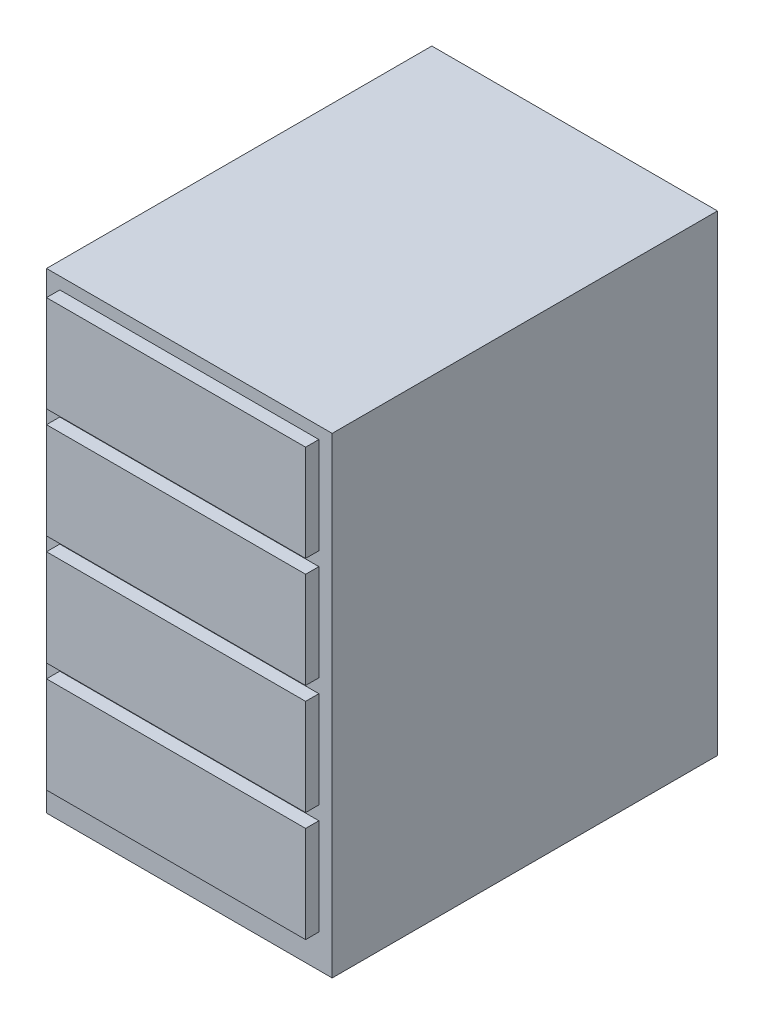
ISO-10303-21;
HEADER;
FILE_DESCRIPTION(('STEP AP214'),'2;1');
FILE_NAME('part.step','',(''),(''),'','','');
FILE_SCHEMA(('AUTOMOTIVE_DESIGN { 1 0 10303 214 1 1 1 1 }'));
ENDSEC;
DATA;
#1=APPLICATION_CONTEXT('core data for automotive mechanical design processes');
#2=APPLICATION_PROTOCOL_DEFINITION('international standard','automotive_design',2000,#1);
#3=PRODUCT_CONTEXT('',#1,'mechanical');
#4=PRODUCT('Part','Part','',(#3));
#5=PRODUCT_RELATED_PRODUCT_CATEGORY('part','',(#4));
#6=PRODUCT_DEFINITION_FORMATION('','',#4);
#7=PRODUCT_DEFINITION_CONTEXT('part definition',#1,'design');
#8=PRODUCT_DEFINITION('design','',#6,#7);
#9=PRODUCT_DEFINITION_SHAPE('','',#8);
#10=(LENGTH_UNIT() NAMED_UNIT(*) SI_UNIT(.MILLI.,.METRE.));
#11=(NAMED_UNIT(*) PLANE_ANGLE_UNIT() SI_UNIT($,.RADIAN.));
#12=(NAMED_UNIT(*) SI_UNIT($,.STERADIAN.) SOLID_ANGLE_UNIT());
#13=UNCERTAINTY_MEASURE_WITH_UNIT(LENGTH_MEASURE(1.E-05),#10,'distance_accuracy_value','');
#14=(GEOMETRIC_REPRESENTATION_CONTEXT(3) GLOBAL_UNCERTAINTY_ASSIGNED_CONTEXT((#13)) GLOBAL_UNIT_ASSIGNED_CONTEXT((#10,
#11,#12)) REPRESENTATION_CONTEXT('',''));
#15=CARTESIAN_POINT('',(0.,0.,0.));
#16=DIRECTION('',(0.,0.,1.));
#17=DIRECTION('',(1.,0.,0.));
#18=AXIS2_PLACEMENT_3D('',#15,#16,#17);
#19=CARTESIAN_POINT('',(0.,0.,580.));
#20=DIRECTION('',(0.,0.,-1.));
#21=DIRECTION('',(-1.,0.,0.));
#22=AXIS2_PLACEMENT_3D('',#19,#20,#21);
#23=PLANE('',#22);
#24=DIRECTION('',(1.,0.,0.));
#25=VECTOR('',#24,1.);
#26=CARTESIAN_POINT('',(20.,547.,580.));
#27=LINE('',#26,#25);
#28=CARTESIAN_POINT('',(20.,547.,580.));
#29=VERTEX_POINT('',#28);
#30=CARTESIAN_POINT('',(410.,547.,580.));
#31=VERTEX_POINT('',#30);
#32=EDGE_CURVE('E190',#29,#31,#27,.T.);
#33=ORIENTED_EDGE('',*,*,#32,.F.);
#34=DIRECTION('',(0.,-1.,0.));
#35=VECTOR('',#34,1.);
#36=CARTESIAN_POINT('',(20.,547.,580.));
#37=LINE('',#36,#35);
#38=CARTESIAN_POINT('',(20.,692.,580.));
#39=VERTEX_POINT('',#38);
#40=EDGE_CURVE('E203',#39,#29,#37,.T.);
#41=ORIENTED_EDGE('',*,*,#40,.F.);
#42=DIRECTION('',(-1.,0.,0.));
#43=VECTOR('',#42,1.);
#44=CARTESIAN_POINT('',(20.,692.,580.));
#45=LINE('',#44,#43);
#46=CARTESIAN_POINT('',(410.,692.,580.));
#47=VERTEX_POINT('',#46);
#48=EDGE_CURVE('E212',#47,#39,#45,.T.);
#49=ORIENTED_EDGE('',*,*,#48,.F.);
#50=DIRECTION('',(0.,1.,0.));
#51=VECTOR('',#50,1.);
#52=CARTESIAN_POINT('',(410.,547.,580.));
#53=LINE('',#52,#51);
#54=EDGE_CURVE('E193',#31,#47,#53,.T.);
#55=ORIENTED_EDGE('',*,*,#54,.F.);
#56=EDGE_LOOP('',(#33,#41,#49,#55));
#57=FACE_BOUND('',#56,.T.);
#58=DIRECTION('',(0.,-1.,0.));
#59=VECTOR('',#58,1.);
#60=CARTESIAN_POINT('',(20.,526.333333333333,580.));
#61=LINE('',#60,#59);
#62=CARTESIAN_POINT('',(20.,526.333333333333,580.));
#63=VERTEX_POINT('',#62);
#64=CARTESIAN_POINT('',(20.,381.333333333333,580.));
#65=VERTEX_POINT('',#64);
#66=EDGE_CURVE('E261',#63,#65,#61,.T.);
#67=ORIENTED_EDGE('',*,*,#66,.F.);
#68=DIRECTION('',(-1.,0.,0.));
#69=VECTOR('',#68,1.);
#70=CARTESIAN_POINT('',(20.,526.333333333333,580.));
#71=LINE('',#70,#69);
#72=CARTESIAN_POINT('',(410.,526.333333333333,580.));
#73=VERTEX_POINT('',#72);
#74=EDGE_CURVE('E266',#73,#63,#71,.T.);
#75=ORIENTED_EDGE('',*,*,#74,.F.);
#76=DIRECTION('',(0.,1.,0.));
#77=VECTOR('',#76,1.);
#78=CARTESIAN_POINT('',(410.,526.333333333333,580.));
#79=LINE('',#78,#77);
#80=CARTESIAN_POINT('',(410.,381.333333333333,580.));
#81=VERTEX_POINT('',#80);
#82=EDGE_CURVE('E278',#81,#73,#79,.T.);
#83=ORIENTED_EDGE('',*,*,#82,.F.);
#84=DIRECTION('',(1.,0.,0.));
#85=VECTOR('',#84,1.);
#86=CARTESIAN_POINT('',(20.,381.333333333333,580.));
#87=LINE('',#86,#85);
#88=EDGE_CURVE('E275',#65,#81,#87,.T.);
#89=ORIENTED_EDGE('',*,*,#88,.F.);
#90=EDGE_LOOP('',(#67,#75,#83,#89));
#91=FACE_BOUND('',#90,.T.);
#92=DIRECTION('',(0.,-1.,0.));
#93=VECTOR('',#92,1.);
#94=CARTESIAN_POINT('',(0.,0.,580.));
#95=LINE('',#94,#93);
#96=CARTESIAN_POINT('',(0.,710.,580.));
#97=VERTEX_POINT('',#96);
#98=CARTESIAN_POINT('',(0.,0.,580.));
#99=VERTEX_POINT('',#98);
#100=EDGE_CURVE('E295',#97,#99,#95,.T.);
#101=ORIENTED_EDGE('',*,*,#100,.T.);
#102=DIRECTION('',(1.,0.,0.));
#103=VECTOR('',#102,1.);
#104=CARTESIAN_POINT('',(0.,0.,580.));
#105=LINE('',#104,#103);
#106=CARTESIAN_POINT('',(430.,0.,580.));
#107=VERTEX_POINT('',#106);
#108=EDGE_CURVE('E298',#99,#107,#105,.T.);
#109=ORIENTED_EDGE('',*,*,#108,.T.);
#110=DIRECTION('',(0.,1.,0.));
#111=VECTOR('',#110,1.);
#112=CARTESIAN_POINT('',(430.,0.,580.));
#113=LINE('',#112,#111);
#114=CARTESIAN_POINT('',(430.,710.,580.));
#115=VERTEX_POINT('',#114);
#116=EDGE_CURVE('E301',#107,#115,#113,.T.);
#117=ORIENTED_EDGE('',*,*,#116,.T.);
#118=DIRECTION('',(-1.,0.,0.));
#119=VECTOR('',#118,1.);
#120=CARTESIAN_POINT('',(0.,710.,580.));
#121=LINE('',#120,#119);
#122=EDGE_CURVE('E303',#115,#97,#121,.T.);
#123=ORIENTED_EDGE('',*,*,#122,.T.);
#124=EDGE_LOOP('',(#101,#109,#117,#123));
#125=FACE_BOUND('',#124,.T.);
#126=DIRECTION('',(0.,-1.,0.));
#127=VECTOR('',#126,1.);
#128=CARTESIAN_POINT('',(20.,195.,580.));
#129=LINE('',#128,#127);
#130=CARTESIAN_POINT('',(20.,195.,580.));
#131=VERTEX_POINT('',#130);
#132=CARTESIAN_POINT('',(20.,50.,580.));
#133=VERTEX_POINT('',#132);
#134=EDGE_CURVE('E228',#131,#133,#129,.T.);
#135=ORIENTED_EDGE('',*,*,#134,.F.);
#136=DIRECTION('',(-1.,0.,0.));
#137=VECTOR('',#136,1.);
#138=CARTESIAN_POINT('',(20.,195.,580.));
#139=LINE('',#138,#137);
#140=CARTESIAN_POINT('',(410.,195.,580.));
#141=VERTEX_POINT('',#140);
#142=EDGE_CURVE('E233',#141,#131,#139,.T.);
#143=ORIENTED_EDGE('',*,*,#142,.F.);
#144=DIRECTION('',(0.,1.,0.));
#145=VECTOR('',#144,1.);
#146=CARTESIAN_POINT('',(410.,195.,580.));
#147=LINE('',#146,#145);
#148=CARTESIAN_POINT('',(410.,50.,580.));
#149=VERTEX_POINT('',#148);
#150=EDGE_CURVE('E245',#149,#141,#147,.T.);
#151=ORIENTED_EDGE('',*,*,#150,.F.);
#152=DIRECTION('',(1.,0.,0.));
#153=VECTOR('',#152,1.);
#154=CARTESIAN_POINT('',(20.,50.,580.));
#155=LINE('',#154,#153);
#156=EDGE_CURVE('E242',#133,#149,#155,.T.);
#157=ORIENTED_EDGE('',*,*,#156,.F.);
#158=EDGE_LOOP('',(#135,#143,#151,#157));
#159=FACE_BOUND('',#158,.T.);
#160=DIRECTION('',(1.,0.,0.));
#161=VECTOR('',#160,1.);
#162=CARTESIAN_POINT('',(20.,215.666666666667,580.));
#163=LINE('',#162,#161);
#164=CARTESIAN_POINT('',(20.,215.666666666667,580.));
#165=VERTEX_POINT('',#164);
#166=CARTESIAN_POINT('',(410.,215.666666666667,580.));
#167=VERTEX_POINT('',#166);
#168=EDGE_CURVE('E189',#165,#167,#163,.T.);
#169=ORIENTED_EDGE('',*,*,#168,.F.);
#170=DIRECTION('',(0.,-1.,0.));
#171=VECTOR('',#170,1.);
#172=CARTESIAN_POINT('',(20.,215.666666666667,580.));
#173=LINE('',#172,#171);
#174=CARTESIAN_POINT('',(20.,360.666666666667,580.));
#175=VERTEX_POINT('',#174);
#176=EDGE_CURVE('E186',#175,#165,#173,.T.);
#177=ORIENTED_EDGE('',*,*,#176,.F.);
#178=DIRECTION('',(-1.,0.,0.));
#179=VECTOR('',#178,1.);
#180=CARTESIAN_POINT('',(20.,360.666666666667,580.));
#181=LINE('',#180,#179);
#182=CARTESIAN_POINT('',(410.,360.666666666667,580.));
#183=VERTEX_POINT('',#182);
#184=EDGE_CURVE('E52',#183,#175,#181,.T.);
#185=ORIENTED_EDGE('',*,*,#184,.F.);
#186=DIRECTION('',(0.,1.,0.));
#187=VECTOR('',#186,1.);
#188=CARTESIAN_POINT('',(410.,215.666666666667,580.));
#189=LINE('',#188,#187);
#190=EDGE_CURVE('E47',#167,#183,#189,.T.);
#191=ORIENTED_EDGE('',*,*,#190,.F.);
#192=EDGE_LOOP('',(#169,#177,#185,#191));
#193=FACE_BOUND('',#192,.T.);
#194=ADVANCED_FACE('F32',(#57,#91,#125,#159,#193),#23,.F.);
#195=CARTESIAN_POINT('',(0.,0.,580.));
#196=DIRECTION('',(1.,0.,0.));
#197=DIRECTION('',(0.,0.,-1.));
#198=AXIS2_PLACEMENT_3D('',#195,#196,#197);
#199=PLANE('',#198);
#200=DIRECTION('',(0.,-1.,0.));
#201=VECTOR('',#200,1.);
#202=CARTESIAN_POINT('',(0.,0.,0.));
#203=LINE('',#202,#201);
#204=CARTESIAN_POINT('',(0.,710.,0.));
#205=VERTEX_POINT('',#204);
#206=CARTESIAN_POINT('',(0.,0.,0.));
#207=VERTEX_POINT('',#206);
#208=EDGE_CURVE('E294',#205,#207,#203,.T.);
#209=ORIENTED_EDGE('',*,*,#208,.T.);
#210=DIRECTION('',(0.,0.,-1.));
#211=VECTOR('',#210,1.);
#212=CARTESIAN_POINT('',(0.,0.,580.));
#213=LINE('',#212,#211);
#214=EDGE_CURVE('E11',#99,#207,#213,.T.);
#215=ORIENTED_EDGE('',*,*,#214,.F.);
#216=ORIENTED_EDGE('',*,*,#100,.F.);
#217=DIRECTION('',(0.,0.,-1.));
#218=VECTOR('',#217,1.);
#219=CARTESIAN_POINT('',(0.,710.,580.));
#220=LINE('',#219,#218);
#221=EDGE_CURVE('E305',#97,#205,#220,.T.);
#222=ORIENTED_EDGE('',*,*,#221,.T.);
#223=EDGE_LOOP('',(#209,#215,#216,#222));
#224=FACE_BOUND('',#223,.T.);
#225=ADVANCED_FACE('F34',(#224),#199,.F.);
#226=CARTESIAN_POINT('',(0.,0.,580.));
#227=DIRECTION('',(0.,1.,0.));
#228=DIRECTION('',(0.,0.,1.));
#229=AXIS2_PLACEMENT_3D('',#226,#227,#228);
#230=PLANE('',#229);
#231=DIRECTION('',(1.,0.,0.));
#232=VECTOR('',#231,1.);
#233=CARTESIAN_POINT('',(0.,0.,0.));
#234=LINE('',#233,#232);
#235=CARTESIAN_POINT('',(430.,0.,0.));
#236=VERTEX_POINT('',#235);
#237=EDGE_CURVE('E308',#207,#236,#234,.T.);
#238=ORIENTED_EDGE('',*,*,#237,.T.);
#239=DIRECTION('',(0.,0.,-1.));
#240=VECTOR('',#239,1.);
#241=CARTESIAN_POINT('',(430.,0.,580.));
#242=LINE('',#241,#240);
#243=EDGE_CURVE('E40',#107,#236,#242,.T.);
#244=ORIENTED_EDGE('',*,*,#243,.F.);
#245=ORIENTED_EDGE('',*,*,#108,.F.);
#246=ORIENTED_EDGE('',*,*,#214,.T.);
#247=EDGE_LOOP('',(#238,#244,#245,#246));
#248=FACE_BOUND('',#247,.T.);
#249=ADVANCED_FACE('F338',(#248),#230,.F.);
#250=CARTESIAN_POINT('',(430.,0.,580.));
#251=DIRECTION('',(-1.,0.,0.));
#252=DIRECTION('',(0.,0.,1.));
#253=AXIS2_PLACEMENT_3D('',#250,#251,#252);
#254=PLANE('',#253);
#255=DIRECTION('',(0.,1.,0.));
#256=VECTOR('',#255,1.);
#257=CARTESIAN_POINT('',(430.,0.,0.));
#258=LINE('',#257,#256);
#259=CARTESIAN_POINT('',(430.,710.,0.));
#260=VERTEX_POINT('',#259);
#261=EDGE_CURVE('E310',#236,#260,#258,.T.);
#262=ORIENTED_EDGE('',*,*,#261,.T.);
#263=DIRECTION('',(0.,0.,-1.));
#264=VECTOR('',#263,1.);
#265=CARTESIAN_POINT('',(430.,710.,580.));
#266=LINE('',#265,#264);
#267=EDGE_CURVE('E315',#115,#260,#266,.T.);
#268=ORIENTED_EDGE('',*,*,#267,.F.);
#269=ORIENTED_EDGE('',*,*,#116,.F.);
#270=ORIENTED_EDGE('',*,*,#243,.T.);
#271=EDGE_LOOP('',(#262,#268,#269,#270));
#272=FACE_BOUND('',#271,.T.);
#273=ADVANCED_FACE('F322',(#272),#254,.F.);
#274=CARTESIAN_POINT('',(0.,710.,580.));
#275=DIRECTION('',(0.,-1.,0.));
#276=DIRECTION('',(0.,0.,-1.));
#277=AXIS2_PLACEMENT_3D('',#274,#275,#276);
#278=PLANE('',#277);
#279=DIRECTION('',(-1.,0.,0.));
#280=VECTOR('',#279,1.);
#281=CARTESIAN_POINT('',(0.,710.,0.));
#282=LINE('',#281,#280);
#283=EDGE_CURVE('E299',#260,#205,#282,.T.);
#284=ORIENTED_EDGE('',*,*,#283,.T.);
#285=ORIENTED_EDGE('',*,*,#221,.F.);
#286=ORIENTED_EDGE('',*,*,#122,.F.);
#287=ORIENTED_EDGE('',*,*,#267,.T.);
#288=EDGE_LOOP('',(#284,#285,#286,#287));
#289=FACE_BOUND('',#288,.T.);
#290=ADVANCED_FACE('F331',(#289),#278,.F.);
#291=CARTESIAN_POINT('',(0.,0.,0.));
#292=DIRECTION('',(0.,0.,-1.));
#293=DIRECTION('',(-1.,0.,0.));
#294=AXIS2_PLACEMENT_3D('',#291,#292,#293);
#295=PLANE('',#294);
#296=ORIENTED_EDGE('',*,*,#208,.F.);
#297=ORIENTED_EDGE('',*,*,#283,.F.);
#298=ORIENTED_EDGE('',*,*,#261,.F.);
#299=ORIENTED_EDGE('',*,*,#237,.F.);
#300=EDGE_LOOP('',(#296,#297,#298,#299));
#301=FACE_BOUND('',#300,.T.);
#302=ADVANCED_FACE('F328',(#301),#295,.T.);
#303=CARTESIAN_POINT('',(20.,526.333333333333,600.));
#304=DIRECTION('',(1.,0.,0.));
#305=DIRECTION('',(0.,0.,-1.));
#306=AXIS2_PLACEMENT_3D('',#303,#304,#305);
#307=PLANE('',#306);
#308=ORIENTED_EDGE('',*,*,#66,.T.);
#309=DIRECTION('',(0.,0.,-1.));
#310=VECTOR('',#309,1.);
#311=CARTESIAN_POINT('',(20.,381.333333333333,600.));
#312=LINE('',#311,#310);
#313=CARTESIAN_POINT('',(20.,381.333333333333,600.));
#314=VERTEX_POINT('',#313);
#315=EDGE_CURVE('E291',#314,#65,#312,.T.);
#316=ORIENTED_EDGE('',*,*,#315,.F.);
#317=DIRECTION('',(0.,-1.,0.));
#318=VECTOR('',#317,1.);
#319=CARTESIAN_POINT('',(20.,526.333333333333,600.));
#320=LINE('',#319,#318);
#321=CARTESIAN_POINT('',(20.,526.333333333333,600.));
#322=VERTEX_POINT('',#321);
#323=EDGE_CURVE('E262',#322,#314,#320,.T.);
#324=ORIENTED_EDGE('',*,*,#323,.F.);
#325=DIRECTION('',(0.,0.,-1.));
#326=VECTOR('',#325,1.);
#327=CARTESIAN_POINT('',(20.,526.333333333333,600.));
#328=LINE('',#327,#326);
#329=EDGE_CURVE('E272',#322,#63,#328,.T.);
#330=ORIENTED_EDGE('',*,*,#329,.T.);
#331=EDGE_LOOP('',(#308,#316,#324,#330));
#332=FACE_BOUND('',#331,.T.);
#333=ADVANCED_FACE('F353',(#332),#307,.F.);
#334=CARTESIAN_POINT('',(20.,381.333333333333,600.));
#335=DIRECTION('',(0.,1.,0.));
#336=DIRECTION('',(-1.,0.,0.));
#337=AXIS2_PLACEMENT_3D('',#334,#335,#336);
#338=PLANE('',#337);
#339=ORIENTED_EDGE('',*,*,#88,.T.);
#340=DIRECTION('',(0.,0.,-1.));
#341=VECTOR('',#340,1.);
#342=CARTESIAN_POINT('',(410.,381.333333333333,600.));
#343=LINE('',#342,#341);
#344=CARTESIAN_POINT('',(410.,381.333333333333,600.));
#345=VERTEX_POINT('',#344);
#346=EDGE_CURVE('E288',#345,#81,#343,.T.);
#347=ORIENTED_EDGE('',*,*,#346,.F.);
#348=DIRECTION('',(1.,0.,0.));
#349=VECTOR('',#348,1.);
#350=CARTESIAN_POINT('',(20.,381.333333333333,600.));
#351=LINE('',#350,#349);
#352=EDGE_CURVE('E265',#314,#345,#351,.T.);
#353=ORIENTED_EDGE('',*,*,#352,.F.);
#354=ORIENTED_EDGE('',*,*,#315,.T.);
#355=EDGE_LOOP('',(#339,#347,#353,#354));
#356=FACE_BOUND('',#355,.T.);
#357=ADVANCED_FACE('F372',(#356),#338,.F.);
#358=CARTESIAN_POINT('',(410.,526.333333333333,600.));
#359=DIRECTION('',(-1.,0.,0.));
#360=DIRECTION('',(0.,-1.,0.));
#361=AXIS2_PLACEMENT_3D('',#358,#359,#360);
#362=PLANE('',#361);
#363=ORIENTED_EDGE('',*,*,#82,.T.);
#364=DIRECTION('',(0.,0.,-1.));
#365=VECTOR('',#364,1.);
#366=CARTESIAN_POINT('',(410.,526.333333333333,600.));
#367=LINE('',#366,#365);
#368=CARTESIAN_POINT('',(410.,526.333333333333,600.));
#369=VERTEX_POINT('',#368);
#370=EDGE_CURVE('E285',#369,#73,#367,.T.);
#371=ORIENTED_EDGE('',*,*,#370,.F.);
#372=DIRECTION('',(0.,1.,0.));
#373=VECTOR('',#372,1.);
#374=CARTESIAN_POINT('',(410.,526.333333333333,600.));
#375=LINE('',#374,#373);
#376=EDGE_CURVE('E268',#345,#369,#375,.T.);
#377=ORIENTED_EDGE('',*,*,#376,.F.);
#378=ORIENTED_EDGE('',*,*,#346,.T.);
#379=EDGE_LOOP('',(#363,#371,#377,#378));
#380=FACE_BOUND('',#379,.T.);
#381=ADVANCED_FACE('F379',(#380),#362,.F.);
#382=CARTESIAN_POINT('',(20.,526.333333333333,600.));
#383=DIRECTION('',(0.,-1.,0.));
#384=DIRECTION('',(0.,0.,-1.));
#385=AXIS2_PLACEMENT_3D('',#382,#383,#384);
#386=PLANE('',#385);
#387=ORIENTED_EDGE('',*,*,#74,.T.);
#388=ORIENTED_EDGE('',*,*,#329,.F.);
#389=DIRECTION('',(-1.,0.,0.));
#390=VECTOR('',#389,1.);
#391=CARTESIAN_POINT('',(20.,526.333333333333,600.));
#392=LINE('',#391,#390);
#393=EDGE_CURVE('E270',#369,#322,#392,.T.);
#394=ORIENTED_EDGE('',*,*,#393,.F.);
#395=ORIENTED_EDGE('',*,*,#370,.T.);
#396=EDGE_LOOP('',(#387,#388,#394,#395));
#397=FACE_BOUND('',#396,.T.);
#398=ADVANCED_FACE('F386',(#397),#386,.F.);
#399=CARTESIAN_POINT('',(0.,0.,600.));
#400=DIRECTION('',(0.,0.,1.));
#401=DIRECTION('',(1.,0.,0.));
#402=AXIS2_PLACEMENT_3D('',#399,#400,#401);
#403=PLANE('',#402);
#404=ORIENTED_EDGE('',*,*,#323,.T.);
#405=ORIENTED_EDGE('',*,*,#352,.T.);
#406=ORIENTED_EDGE('',*,*,#376,.T.);
#407=ORIENTED_EDGE('',*,*,#393,.T.);
#408=EDGE_LOOP('',(#404,#405,#406,#407));
#409=FACE_BOUND('',#408,.T.);
#410=ADVANCED_FACE('F394',(#409),#403,.T.);
#411=CARTESIAN_POINT('',(20.,195.,600.));
#412=DIRECTION('',(1.,0.,0.));
#413=DIRECTION('',(0.,0.,-1.));
#414=AXIS2_PLACEMENT_3D('',#411,#412,#413);
#415=PLANE('',#414);
#416=ORIENTED_EDGE('',*,*,#134,.T.);
#417=DIRECTION('',(0.,0.,-1.));
#418=VECTOR('',#417,1.);
#419=CARTESIAN_POINT('',(20.,50.,600.));
#420=LINE('',#419,#418);
#421=CARTESIAN_POINT('',(20.,50.,600.));
#422=VERTEX_POINT('',#421);
#423=EDGE_CURVE('E258',#422,#133,#420,.T.);
#424=ORIENTED_EDGE('',*,*,#423,.F.);
#425=DIRECTION('',(0.,-1.,0.));
#426=VECTOR('',#425,1.);
#427=CARTESIAN_POINT('',(20.,195.,600.));
#428=LINE('',#427,#426);
#429=CARTESIAN_POINT('',(20.,195.,600.));
#430=VERTEX_POINT('',#429);
#431=EDGE_CURVE('E229',#430,#422,#428,.T.);
#432=ORIENTED_EDGE('',*,*,#431,.F.);
#433=DIRECTION('',(0.,0.,-1.));
#434=VECTOR('',#433,1.);
#435=CARTESIAN_POINT('',(20.,195.,600.));
#436=LINE('',#435,#434);
#437=EDGE_CURVE('E239',#430,#131,#436,.T.);
#438=ORIENTED_EDGE('',*,*,#437,.T.);
#439=EDGE_LOOP('',(#416,#424,#432,#438));
#440=FACE_BOUND('',#439,.T.);
#441=ADVANCED_FACE('F402',(#440),#415,.F.);
#442=CARTESIAN_POINT('',(20.,50.,600.));
#443=DIRECTION('',(0.,1.,0.));
#444=DIRECTION('',(-1.,0.,0.));
#445=AXIS2_PLACEMENT_3D('',#442,#443,#444);
#446=PLANE('',#445);
#447=ORIENTED_EDGE('',*,*,#156,.T.);
#448=DIRECTION('',(0.,0.,-1.));
#449=VECTOR('',#448,1.);
#450=CARTESIAN_POINT('',(410.,50.,600.));
#451=LINE('',#450,#449);
#452=CARTESIAN_POINT('',(410.,50.,600.));
#453=VERTEX_POINT('',#452);
#454=EDGE_CURVE('E255',#453,#149,#451,.T.);
#455=ORIENTED_EDGE('',*,*,#454,.F.);
#456=DIRECTION('',(1.,0.,0.));
#457=VECTOR('',#456,1.);
#458=CARTESIAN_POINT('',(20.,50.,600.));
#459=LINE('',#458,#457);
#460=EDGE_CURVE('E232',#422,#453,#459,.T.);
#461=ORIENTED_EDGE('',*,*,#460,.F.);
#462=ORIENTED_EDGE('',*,*,#423,.T.);
#463=EDGE_LOOP('',(#447,#455,#461,#462));
#464=FACE_BOUND('',#463,.T.);
#465=ADVANCED_FACE('F410',(#464),#446,.F.);
#466=CARTESIAN_POINT('',(410.,195.,600.));
#467=DIRECTION('',(-1.,0.,0.));
#468=DIRECTION('',(0.,-1.,0.));
#469=AXIS2_PLACEMENT_3D('',#466,#467,#468);
#470=PLANE('',#469);
#471=ORIENTED_EDGE('',*,*,#150,.T.);
#472=DIRECTION('',(0.,0.,-1.));
#473=VECTOR('',#472,1.);
#474=CARTESIAN_POINT('',(410.,195.,600.));
#475=LINE('',#474,#473);
#476=CARTESIAN_POINT('',(410.,195.,600.));
#477=VERTEX_POINT('',#476);
#478=EDGE_CURVE('E252',#477,#141,#475,.T.);
#479=ORIENTED_EDGE('',*,*,#478,.F.);
#480=DIRECTION('',(0.,1.,0.));
#481=VECTOR('',#480,1.);
#482=CARTESIAN_POINT('',(410.,195.,600.));
#483=LINE('',#482,#481);
#484=EDGE_CURVE('E235',#453,#477,#483,.T.);
#485=ORIENTED_EDGE('',*,*,#484,.F.);
#486=ORIENTED_EDGE('',*,*,#454,.T.);
#487=EDGE_LOOP('',(#471,#479,#485,#486));
#488=FACE_BOUND('',#487,.T.);
#489=ADVANCED_FACE('F418',(#488),#470,.F.);
#490=CARTESIAN_POINT('',(20.,195.,600.));
#491=DIRECTION('',(0.,-1.,0.));
#492=DIRECTION('',(1.,0.,0.));
#493=AXIS2_PLACEMENT_3D('',#490,#491,#492);
#494=PLANE('',#493);
#495=ORIENTED_EDGE('',*,*,#142,.T.);
#496=ORIENTED_EDGE('',*,*,#437,.F.);
#497=DIRECTION('',(-1.,0.,0.));
#498=VECTOR('',#497,1.);
#499=CARTESIAN_POINT('',(20.,195.,600.));
#500=LINE('',#499,#498);
#501=EDGE_CURVE('E237',#477,#430,#500,.T.);
#502=ORIENTED_EDGE('',*,*,#501,.F.);
#503=ORIENTED_EDGE('',*,*,#478,.T.);
#504=EDGE_LOOP('',(#495,#496,#502,#503));
#505=FACE_BOUND('',#504,.T.);
#506=ADVANCED_FACE('F426',(#505),#494,.F.);
#507=CARTESIAN_POINT('',(0.,0.,600.));
#508=DIRECTION('',(0.,0.,1.));
#509=DIRECTION('',(1.,0.,0.));
#510=AXIS2_PLACEMENT_3D('',#507,#508,#509);
#511=PLANE('',#510);
#512=ORIENTED_EDGE('',*,*,#431,.T.);
#513=ORIENTED_EDGE('',*,*,#460,.T.);
#514=ORIENTED_EDGE('',*,*,#484,.T.);
#515=ORIENTED_EDGE('',*,*,#501,.T.);
#516=EDGE_LOOP('',(#512,#513,#514,#515));
#517=FACE_BOUND('',#516,.T.);
#518=ADVANCED_FACE('F434',(#517),#511,.T.);
#519=CARTESIAN_POINT('',(20.,547.,600.));
#520=DIRECTION('',(0.,1.,0.));
#521=DIRECTION('',(0.,0.,1.));
#522=AXIS2_PLACEMENT_3D('',#519,#520,#521);
#523=PLANE('',#522);
#524=ORIENTED_EDGE('',*,*,#32,.T.);
#525=DIRECTION('',(0.,0.,-1.));
#526=VECTOR('',#525,1.);
#527=CARTESIAN_POINT('',(410.,547.,600.));
#528=LINE('',#527,#526);
#529=CARTESIAN_POINT('',(410.,547.,600.));
#530=VERTEX_POINT('',#529);
#531=EDGE_CURVE('E225',#530,#31,#528,.T.);
#532=ORIENTED_EDGE('',*,*,#531,.F.);
#533=DIRECTION('',(1.,0.,0.));
#534=VECTOR('',#533,1.);
#535=CARTESIAN_POINT('',(20.,547.,600.));
#536=LINE('',#535,#534);
#537=CARTESIAN_POINT('',(20.,547.,600.));
#538=VERTEX_POINT('',#537);
#539=EDGE_CURVE('E199',#538,#530,#536,.T.);
#540=ORIENTED_EDGE('',*,*,#539,.F.);
#541=DIRECTION('',(0.,0.,-1.));
#542=VECTOR('',#541,1.);
#543=CARTESIAN_POINT('',(20.,547.,600.));
#544=LINE('',#543,#542);
#545=EDGE_CURVE('E208',#538,#29,#544,.T.);
#546=ORIENTED_EDGE('',*,*,#545,.T.);
#547=EDGE_LOOP('',(#524,#532,#540,#546));
#548=FACE_BOUND('',#547,.T.);
#549=ADVANCED_FACE('F442',(#548),#523,.F.);
#550=CARTESIAN_POINT('',(410.,547.,600.));
#551=DIRECTION('',(-1.,0.,0.));
#552=DIRECTION('',(0.,-1.,0.));
#553=AXIS2_PLACEMENT_3D('',#550,#551,#552);
#554=PLANE('',#553);
#555=ORIENTED_EDGE('',*,*,#54,.T.);
#556=DIRECTION('',(0.,0.,-1.));
#557=VECTOR('',#556,1.);
#558=CARTESIAN_POINT('',(410.,692.,600.));
#559=LINE('',#558,#557);
#560=CARTESIAN_POINT('',(410.,692.,600.));
#561=VERTEX_POINT('',#560);
#562=EDGE_CURVE('E222',#561,#47,#559,.T.);
#563=ORIENTED_EDGE('',*,*,#562,.F.);
#564=DIRECTION('',(0.,1.,0.));
#565=VECTOR('',#564,1.);
#566=CARTESIAN_POINT('',(410.,547.,600.));
#567=LINE('',#566,#565);
#568=EDGE_CURVE('E202',#530,#561,#567,.T.);
#569=ORIENTED_EDGE('',*,*,#568,.F.);
#570=ORIENTED_EDGE('',*,*,#531,.T.);
#571=EDGE_LOOP('',(#555,#563,#569,#570));
#572=FACE_BOUND('',#571,.T.);
#573=ADVANCED_FACE('F450',(#572),#554,.F.);
#574=CARTESIAN_POINT('',(20.,692.,600.));
#575=DIRECTION('',(0.,-1.,0.));
#576=DIRECTION('',(0.,0.,-1.));
#577=AXIS2_PLACEMENT_3D('',#574,#575,#576);
#578=PLANE('',#577);
#579=ORIENTED_EDGE('',*,*,#48,.T.);
#580=DIRECTION('',(0.,0.,-1.));
#581=VECTOR('',#580,1.);
#582=CARTESIAN_POINT('',(20.,692.,600.));
#583=LINE('',#582,#581);
#584=CARTESIAN_POINT('',(20.,692.,600.));
#585=VERTEX_POINT('',#584);
#586=EDGE_CURVE('E219',#585,#39,#583,.T.);
#587=ORIENTED_EDGE('',*,*,#586,.F.);
#588=DIRECTION('',(-1.,0.,0.));
#589=VECTOR('',#588,1.);
#590=CARTESIAN_POINT('',(20.,692.,600.));
#591=LINE('',#590,#589);
#592=EDGE_CURVE('E205',#561,#585,#591,.T.);
#593=ORIENTED_EDGE('',*,*,#592,.F.);
#594=ORIENTED_EDGE('',*,*,#562,.T.);
#595=EDGE_LOOP('',(#579,#587,#593,#594));
#596=FACE_BOUND('',#595,.T.);
#597=ADVANCED_FACE('F458',(#596),#578,.F.);
#598=CARTESIAN_POINT('',(20.,547.,600.));
#599=DIRECTION('',(1.,0.,0.));
#600=DIRECTION('',(0.,1.,0.));
#601=AXIS2_PLACEMENT_3D('',#598,#599,#600);
#602=PLANE('',#601);
#603=ORIENTED_EDGE('',*,*,#40,.T.);
#604=ORIENTED_EDGE('',*,*,#545,.F.);
#605=DIRECTION('',(0.,-1.,0.));
#606=VECTOR('',#605,1.);
#607=CARTESIAN_POINT('',(20.,547.,600.));
#608=LINE('',#607,#606);
#609=EDGE_CURVE('E207',#585,#538,#608,.T.);
#610=ORIENTED_EDGE('',*,*,#609,.F.);
#611=ORIENTED_EDGE('',*,*,#586,.T.);
#612=EDGE_LOOP('',(#603,#604,#610,#611));
#613=FACE_BOUND('',#612,.T.);
#614=ADVANCED_FACE('F466',(#613),#602,.F.);
#615=CARTESIAN_POINT('',(0.,0.,600.));
#616=DIRECTION('',(0.,0.,1.));
#617=DIRECTION('',(1.,0.,0.));
#618=AXIS2_PLACEMENT_3D('',#615,#616,#617);
#619=PLANE('',#618);
#620=ORIENTED_EDGE('',*,*,#539,.T.);
#621=ORIENTED_EDGE('',*,*,#568,.T.);
#622=ORIENTED_EDGE('',*,*,#592,.T.);
#623=ORIENTED_EDGE('',*,*,#609,.T.);
#624=EDGE_LOOP('',(#620,#621,#622,#623));
#625=FACE_BOUND('',#624,.T.);
#626=ADVANCED_FACE('F474',(#625),#619,.T.);
#627=CARTESIAN_POINT('',(20.,215.666666666667,600.));
#628=DIRECTION('',(0.,1.,0.));
#629=DIRECTION('',(0.,0.,1.));
#630=AXIS2_PLACEMENT_3D('',#627,#628,#629);
#631=PLANE('',#630);
#632=ORIENTED_EDGE('',*,*,#168,.T.);
#633=DIRECTION('',(0.,0.,-1.));
#634=VECTOR('',#633,1.);
#635=CARTESIAN_POINT('',(410.,215.666666666667,600.));
#636=LINE('',#635,#634);
#637=CARTESIAN_POINT('',(410.,215.666666666667,600.));
#638=VERTEX_POINT('',#637);
#639=EDGE_CURVE('E170',#638,#167,#636,.T.);
#640=ORIENTED_EDGE('',*,*,#639,.F.);
#641=DIRECTION('',(1.,0.,0.));
#642=VECTOR('',#641,1.);
#643=CARTESIAN_POINT('',(20.,215.666666666667,600.));
#644=LINE('',#643,#642);
#645=CARTESIAN_POINT('',(20.,215.666666666667,600.));
#646=VERTEX_POINT('',#645);
#647=EDGE_CURVE('E177',#646,#638,#644,.T.);
#648=ORIENTED_EDGE('',*,*,#647,.F.);
#649=DIRECTION('',(0.,0.,-1.));
#650=VECTOR('',#649,1.);
#651=CARTESIAN_POINT('',(20.,215.666666666667,600.));
#652=LINE('',#651,#650);
#653=EDGE_CURVE('E583',#646,#165,#652,.T.);
#654=ORIENTED_EDGE('',*,*,#653,.T.);
#655=EDGE_LOOP('',(#632,#640,#648,#654));
#656=FACE_BOUND('',#655,.T.);
#657=ADVANCED_FACE('F188',(#656),#631,.F.);
#658=CARTESIAN_POINT('',(410.,215.666666666667,600.));
#659=DIRECTION('',(-1.,0.,0.));
#660=DIRECTION('',(0.,-1.,0.));
#661=AXIS2_PLACEMENT_3D('',#658,#659,#660);
#662=PLANE('',#661);
#663=ORIENTED_EDGE('',*,*,#190,.T.);
#664=DIRECTION('',(0.,0.,-1.));
#665=VECTOR('',#664,1.);
#666=CARTESIAN_POINT('',(410.,360.666666666667,600.));
#667=LINE('',#666,#665);
#668=CARTESIAN_POINT('',(410.,360.666666666667,600.));
#669=VERTEX_POINT('',#668);
#670=EDGE_CURVE('E173',#669,#183,#667,.T.);
#671=ORIENTED_EDGE('',*,*,#670,.F.);
#672=DIRECTION('',(0.,1.,0.));
#673=VECTOR('',#672,1.);
#674=CARTESIAN_POINT('',(410.,215.666666666667,600.));
#675=LINE('',#674,#673);
#676=EDGE_CURVE('E166',#638,#669,#675,.T.);
#677=ORIENTED_EDGE('',*,*,#676,.F.);
#678=ORIENTED_EDGE('',*,*,#639,.T.);
#679=EDGE_LOOP('',(#663,#671,#677,#678));
#680=FACE_BOUND('',#679,.T.);
#681=ADVANCED_FACE('F168',(#680),#662,.F.);
#682=CARTESIAN_POINT('',(20.,360.666666666667,600.));
#683=DIRECTION('',(0.,-1.,0.));
#684=DIRECTION('',(0.,0.,-1.));
#685=AXIS2_PLACEMENT_3D('',#682,#683,#684);
#686=PLANE('',#685);
#687=ORIENTED_EDGE('',*,*,#184,.T.);
#688=DIRECTION('',(0.,0.,-1.));
#689=VECTOR('',#688,1.);
#690=CARTESIAN_POINT('',(20.,360.666666666667,600.));
#691=LINE('',#690,#689);
#692=CARTESIAN_POINT('',(20.,360.666666666667,600.));
#693=VERTEX_POINT('',#692);
#694=EDGE_CURVE('E195',#693,#175,#691,.T.);
#695=ORIENTED_EDGE('',*,*,#694,.F.);
#696=DIRECTION('',(-1.,0.,0.));
#697=VECTOR('',#696,1.);
#698=CARTESIAN_POINT('',(20.,360.666666666667,600.));
#699=LINE('',#698,#697);
#700=EDGE_CURVE('E176',#669,#693,#699,.T.);
#701=ORIENTED_EDGE('',*,*,#700,.F.);
#702=ORIENTED_EDGE('',*,*,#670,.T.);
#703=EDGE_LOOP('',(#687,#695,#701,#702));
#704=FACE_BOUND('',#703,.T.);
#705=ADVANCED_FACE('F495',(#704),#686,.F.);
#706=CARTESIAN_POINT('',(20.,215.666666666667,600.));
#707=DIRECTION('',(1.,0.,0.));
#708=DIRECTION('',(0.,1.,0.));
#709=AXIS2_PLACEMENT_3D('',#706,#707,#708);
#710=PLANE('',#709);
#711=ORIENTED_EDGE('',*,*,#176,.T.);
#712=ORIENTED_EDGE('',*,*,#653,.F.);
#713=DIRECTION('',(0.,-1.,0.));
#714=VECTOR('',#713,1.);
#715=CARTESIAN_POINT('',(20.,215.666666666667,600.));
#716=LINE('',#715,#714);
#717=EDGE_CURVE('E182',#693,#646,#716,.T.);
#718=ORIENTED_EDGE('',*,*,#717,.F.);
#719=ORIENTED_EDGE('',*,*,#694,.T.);
#720=EDGE_LOOP('',(#711,#712,#718,#719));
#721=FACE_BOUND('',#720,.T.);
#722=ADVANCED_FACE('F502',(#721),#710,.F.);
#723=CARTESIAN_POINT('',(0.,0.,600.));
#724=DIRECTION('',(0.,0.,1.));
#725=DIRECTION('',(1.,0.,0.));
#726=AXIS2_PLACEMENT_3D('',#723,#724,#725);
#727=PLANE('',#726);
#728=ORIENTED_EDGE('',*,*,#647,.T.);
#729=ORIENTED_EDGE('',*,*,#676,.T.);
#730=ORIENTED_EDGE('',*,*,#700,.T.);
#731=ORIENTED_EDGE('',*,*,#717,.T.);
#732=EDGE_LOOP('',(#728,#729,#730,#731));
#733=FACE_BOUND('',#732,.T.);
#734=ADVANCED_FACE('F180',(#733),#727,.T.);
#735=CLOSED_SHELL('',(#194,#225,#249,#273,#290,#302,#333,#357,#381,#398,#410,#441,#465,#489,
#506,#518,#549,#573,#597,#614,#626,#657,#681,#705,#722,#734));
#736=MANIFOLD_SOLID_BREP('B2',#735);
#737=ADVANCED_BREP_SHAPE_REPRESENTATION('',(#18,#736),#14);
#738=SHAPE_DEFINITION_REPRESENTATION(#9,#737);
ENDSEC;
END-ISO-10303-21;
